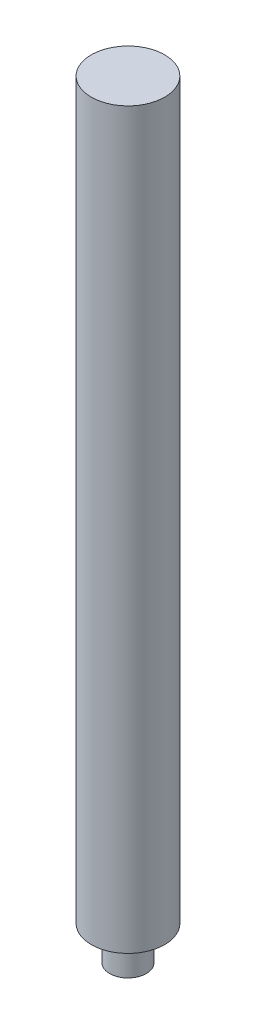
ISO-10303-21;
HEADER;
FILE_DESCRIPTION(('STEP AP214'),'2;1');
FILE_NAME('part.step','',(''),(''),'','','');
FILE_SCHEMA(('AUTOMOTIVE_DESIGN { 1 0 10303 214 1 1 1 1 }'));
ENDSEC;
DATA;
#1=APPLICATION_CONTEXT('core data for automotive mechanical design processes');
#2=APPLICATION_PROTOCOL_DEFINITION('international standard','automotive_design',2000,#1);
#3=PRODUCT_CONTEXT('',#1,'mechanical');
#4=PRODUCT('Part','Part','',(#3));
#5=PRODUCT_RELATED_PRODUCT_CATEGORY('part','',(#4));
#6=PRODUCT_DEFINITION_FORMATION('','',#4);
#7=PRODUCT_DEFINITION_CONTEXT('part definition',#1,'design');
#8=PRODUCT_DEFINITION('design','',#6,#7);
#9=PRODUCT_DEFINITION_SHAPE('','',#8);
#10=(LENGTH_UNIT() NAMED_UNIT(*) SI_UNIT(.MILLI.,.METRE.));
#11=(NAMED_UNIT(*) PLANE_ANGLE_UNIT() SI_UNIT($,.RADIAN.));
#12=(NAMED_UNIT(*) SI_UNIT($,.STERADIAN.) SOLID_ANGLE_UNIT());
#13=UNCERTAINTY_MEASURE_WITH_UNIT(LENGTH_MEASURE(1.E-05),#10,'distance_accuracy_value','');
#14=(GEOMETRIC_REPRESENTATION_CONTEXT(3) GLOBAL_UNCERTAINTY_ASSIGNED_CONTEXT((#13)) GLOBAL_UNIT_ASSIGNED_CONTEXT((#10,
#11,#12)) REPRESENTATION_CONTEXT('',''));
#15=CARTESIAN_POINT('',(0.,0.,0.));
#16=DIRECTION('',(0.,0.,1.));
#17=DIRECTION('',(1.,0.,0.));
#18=AXIS2_PLACEMENT_3D('',#15,#16,#17);
#19=CARTESIAN_POINT('',(0.,2.8,0.));
#20=DIRECTION('',(0.,-1.,0.));
#21=DIRECTION('',(0.,0.,-1.));
#22=AXIS2_PLACEMENT_3D('',#19,#20,#21);
#23=CYLINDRICAL_SURFACE('',#22,1.5);
#24=CARTESIAN_POINT('',(0.,2.8,0.));
#25=DIRECTION('',(0.,1.,0.));
#26=DIRECTION('',(0.,0.,1.));
#27=AXIS2_PLACEMENT_3D('',#24,#25,#26);
#28=CIRCLE('',#27,1.5);
#29=CARTESIAN_POINT('',(0.,2.8,1.5));
#30=VERTEX_POINT('',#29);
#31=EDGE_CURVE('E10',#30,#30,#28,.T.);
#32=ORIENTED_EDGE('',*,*,#31,.F.);
#33=EDGE_LOOP('',(#32));
#34=FACE_BOUND('',#33,.T.);
#35=CARTESIAN_POINT('',(0.,0.,0.));
#36=DIRECTION('',(0.,1.,0.));
#37=DIRECTION('',(0.,0.,1.));
#38=AXIS2_PLACEMENT_3D('',#35,#36,#37);
#39=CIRCLE('',#38,1.5);
#40=CARTESIAN_POINT('',(0.,0.,1.5));
#41=VERTEX_POINT('',#40);
#42=EDGE_CURVE('E42',#41,#41,#39,.T.);
#43=ORIENTED_EDGE('',*,*,#42,.T.);
#44=EDGE_LOOP('',(#43));
#45=FACE_BOUND('',#44,.T.);
#46=ADVANCED_FACE('F39',(#34,#45),#23,.T.);
#47=CARTESIAN_POINT('',(0.,0.,0.));
#48=DIRECTION('',(0.,1.,0.));
#49=DIRECTION('',(0.,0.,1.));
#50=AXIS2_PLACEMENT_3D('',#47,#48,#49);
#51=PLANE('',#50);
#52=ORIENTED_EDGE('',*,*,#42,.F.);
#53=EDGE_LOOP('',(#52));
#54=FACE_BOUND('',#53,.T.);
#55=ADVANCED_FACE('F66',(#54),#51,.F.);
#56=CARTESIAN_POINT('',(0.,62.8,0.));
#57=DIRECTION('',(0.,-1.,0.));
#58=DIRECTION('',(0.,0.,-1.));
#59=AXIS2_PLACEMENT_3D('',#56,#57,#58);
#60=CYLINDRICAL_SURFACE('',#59,3.);
#61=CARTESIAN_POINT('',(0.,62.8,0.));
#62=DIRECTION('',(0.,1.,0.));
#63=DIRECTION('',(0.,0.,1.));
#64=AXIS2_PLACEMENT_3D('',#61,#62,#63);
#65=CIRCLE('',#64,3.);
#66=CARTESIAN_POINT('',(0.,62.8,3.));
#67=VERTEX_POINT('',#66);
#68=EDGE_CURVE('E51',#67,#67,#65,.T.);
#69=ORIENTED_EDGE('',*,*,#68,.F.);
#70=EDGE_LOOP('',(#69));
#71=FACE_BOUND('',#70,.T.);
#72=CARTESIAN_POINT('',(0.,2.8,0.));
#73=DIRECTION('',(0.,1.,0.));
#74=DIRECTION('',(0.,0.,1.));
#75=AXIS2_PLACEMENT_3D('',#72,#73,#74);
#76=CIRCLE('',#75,3.);
#77=CARTESIAN_POINT('',(0.,2.8,3.));
#78=VERTEX_POINT('',#77);
#79=EDGE_CURVE('E53',#78,#78,#76,.T.);
#80=ORIENTED_EDGE('',*,*,#79,.T.);
#81=EDGE_LOOP('',(#80));
#82=FACE_BOUND('',#81,.T.);
#83=ADVANCED_FACE('F63',(#71,#82),#60,.T.);
#84=CARTESIAN_POINT('',(0.,62.8,0.));
#85=DIRECTION('',(0.,1.,0.));
#86=DIRECTION('',(0.,0.,1.));
#87=AXIS2_PLACEMENT_3D('',#84,#85,#86);
#88=PLANE('',#87);
#89=ORIENTED_EDGE('',*,*,#68,.T.);
#90=EDGE_LOOP('',(#89));
#91=FACE_BOUND('',#90,.T.);
#92=ADVANCED_FACE('F61',(#91),#88,.T.);
#93=CARTESIAN_POINT('',(0.,2.8,0.));
#94=DIRECTION('',(0.,1.,0.));
#95=DIRECTION('',(0.,0.,1.));
#96=AXIS2_PLACEMENT_3D('',#93,#94,#95);
#97=PLANE('',#96);
#98=ORIENTED_EDGE('',*,*,#31,.T.);
#99=EDGE_LOOP('',(#98));
#100=FACE_BOUND('',#99,.T.);
#101=ORIENTED_EDGE('',*,*,#79,.F.);
#102=EDGE_LOOP('',(#101));
#103=FACE_BOUND('',#102,.T.);
#104=ADVANCED_FACE('F70',(#100,#103),#97,.F.);
#105=CLOSED_SHELL('',(#46,#55,#83,#92,#104));
#106=MANIFOLD_SOLID_BREP('B2',#105);
#107=ADVANCED_BREP_SHAPE_REPRESENTATION('',(#18,#106),#14);
#108=SHAPE_DEFINITION_REPRESENTATION(#9,#107);
ENDSEC;
END-ISO-10303-21;
